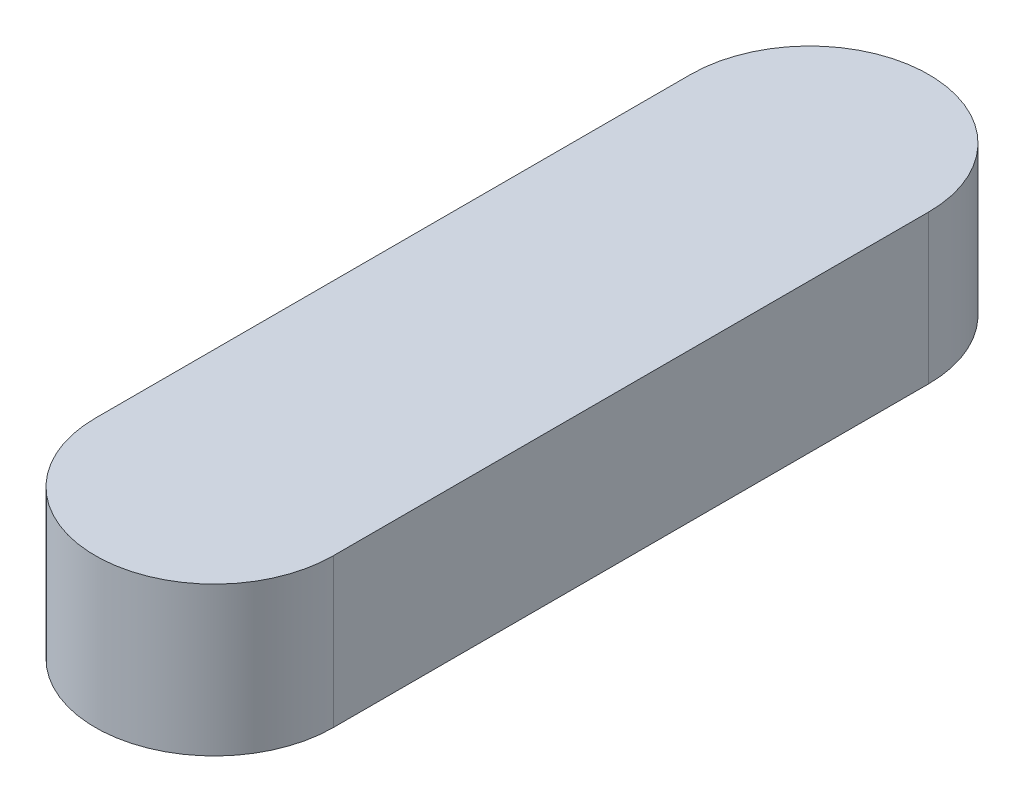
ISO-10303-21;
HEADER;
FILE_DESCRIPTION(('STEP AP214'),'2;1');
FILE_NAME('part.step','',(''),(''),'','','');
FILE_SCHEMA(('AUTOMOTIVE_DESIGN { 1 0 10303 214 1 1 1 1 }'));
ENDSEC;
DATA;
#1=APPLICATION_CONTEXT('core data for automotive mechanical design processes');
#2=APPLICATION_PROTOCOL_DEFINITION('international standard','automotive_design',2000,#1);
#3=PRODUCT_CONTEXT('',#1,'mechanical');
#4=PRODUCT('Part','Part','',(#3));
#5=PRODUCT_RELATED_PRODUCT_CATEGORY('part','',(#4));
#6=PRODUCT_DEFINITION_FORMATION('','',#4);
#7=PRODUCT_DEFINITION_CONTEXT('part definition',#1,'design');
#8=PRODUCT_DEFINITION('design','',#6,#7);
#9=PRODUCT_DEFINITION_SHAPE('','',#8);
#10=(LENGTH_UNIT() NAMED_UNIT(*) SI_UNIT(.MILLI.,.METRE.));
#11=(NAMED_UNIT(*) PLANE_ANGLE_UNIT() SI_UNIT($,.RADIAN.));
#12=(NAMED_UNIT(*) SI_UNIT($,.STERADIAN.) SOLID_ANGLE_UNIT());
#13=UNCERTAINTY_MEASURE_WITH_UNIT(LENGTH_MEASURE(1.E-05),#10,'distance_accuracy_value','');
#14=(GEOMETRIC_REPRESENTATION_CONTEXT(3) GLOBAL_UNCERTAINTY_ASSIGNED_CONTEXT((#13)) GLOBAL_UNIT_ASSIGNED_CONTEXT((#10,
#11,#12)) REPRESENTATION_CONTEXT('',''));
#15=CARTESIAN_POINT('',(0.,0.,0.));
#16=DIRECTION('',(0.,0.,1.));
#17=DIRECTION('',(1.,0.,0.));
#18=AXIS2_PLACEMENT_3D('',#15,#16,#17);
#19=CARTESIAN_POINT('',(0.,-5.,20.));
#20=DIRECTION('',(0.,1.,0.));
#21=DIRECTION('',(0.,0.,1.));
#22=AXIS2_PLACEMENT_3D('',#19,#20,#21);
#23=CYLINDRICAL_SURFACE('',#22,8.);
#24=CARTESIAN_POINT('',(0.,5.,20.));
#25=DIRECTION('',(0.,1.,0.));
#26=DIRECTION('',(0.,0.,1.));
#27=AXIS2_PLACEMENT_3D('',#24,#25,#26);
#28=CIRCLE('',#27,8.);
#29=CARTESIAN_POINT('',(-8.,5.,20.));
#30=VERTEX_POINT('',#29);
#31=CARTESIAN_POINT('',(8.,5.,20.));
#32=VERTEX_POINT('',#31);
#33=EDGE_CURVE('E105',#30,#32,#28,.T.);
#34=ORIENTED_EDGE('',*,*,#33,.F.);
#35=DIRECTION('',(0.,1.,0.));
#36=VECTOR('',#35,1.);
#37=CARTESIAN_POINT('',(-8.,-5.,20.));
#38=LINE('',#37,#36);
#39=CARTESIAN_POINT('',(-8.,-5.,20.));
#40=VERTEX_POINT('',#39);
#41=EDGE_CURVE('E11',#40,#30,#38,.T.);
#42=ORIENTED_EDGE('',*,*,#41,.F.);
#43=CARTESIAN_POINT('',(0.,-5.,20.));
#44=DIRECTION('',(0.,1.,0.));
#45=DIRECTION('',(0.,0.,1.));
#46=AXIS2_PLACEMENT_3D('',#43,#44,#45);
#47=CIRCLE('',#46,8.);
#48=CARTESIAN_POINT('',(8.,-5.,20.));
#49=VERTEX_POINT('',#48);
#50=EDGE_CURVE('E99',#40,#49,#47,.T.);
#51=ORIENTED_EDGE('',*,*,#50,.T.);
#52=DIRECTION('',(0.,1.,0.));
#53=VECTOR('',#52,1.);
#54=CARTESIAN_POINT('',(8.,-5.,20.));
#55=LINE('',#54,#53);
#56=EDGE_CURVE('E44',#49,#32,#55,.T.);
#57=ORIENTED_EDGE('',*,*,#56,.T.);
#58=EDGE_LOOP('',(#34,#42,#51,#57));
#59=FACE_BOUND('',#58,.T.);
#60=ADVANCED_FACE('F41',(#59),#23,.T.);
#61=CARTESIAN_POINT('',(-8.,-5.,20.));
#62=DIRECTION('',(-1.,0.,0.));
#63=DIRECTION('',(0.,0.,1.));
#64=AXIS2_PLACEMENT_3D('',#61,#62,#63);
#65=PLANE('',#64);
#66=DIRECTION('',(0.,0.,1.));
#67=VECTOR('',#66,1.);
#68=CARTESIAN_POINT('',(-8.,5.,20.));
#69=LINE('',#68,#67);
#70=CARTESIAN_POINT('',(-8.,5.,-20.));
#71=VERTEX_POINT('',#70);
#72=EDGE_CURVE('E101',#71,#30,#69,.T.);
#73=ORIENTED_EDGE('',*,*,#72,.F.);
#74=DIRECTION('',(0.,1.,0.));
#75=VECTOR('',#74,1.);
#76=CARTESIAN_POINT('',(-8.,-5.,-20.));
#77=LINE('',#76,#75);
#78=CARTESIAN_POINT('',(-8.,-5.,-20.));
#79=VERTEX_POINT('',#78);
#80=EDGE_CURVE('E50',#79,#71,#77,.T.);
#81=ORIENTED_EDGE('',*,*,#80,.F.);
#82=DIRECTION('',(0.,0.,1.));
#83=VECTOR('',#82,1.);
#84=CARTESIAN_POINT('',(-8.,-5.,20.));
#85=LINE('',#84,#83);
#86=EDGE_CURVE('E96',#79,#40,#85,.T.);
#87=ORIENTED_EDGE('',*,*,#86,.T.);
#88=ORIENTED_EDGE('',*,*,#41,.T.);
#89=EDGE_LOOP('',(#73,#81,#87,#88));
#90=FACE_BOUND('',#89,.T.);
#91=ADVANCED_FACE('F115',(#90),#65,.T.);
#92=CARTESIAN_POINT('',(0.,-5.,-20.));
#93=DIRECTION('',(0.,1.,0.));
#94=DIRECTION('',(0.,0.,1.));
#95=AXIS2_PLACEMENT_3D('',#92,#93,#94);
#96=CYLINDRICAL_SURFACE('',#95,8.);
#97=CARTESIAN_POINT('',(0.,5.,-20.));
#98=DIRECTION('',(0.,1.,0.));
#99=DIRECTION('',(0.,0.,1.));
#100=AXIS2_PLACEMENT_3D('',#97,#98,#99);
#101=CIRCLE('',#100,8.);
#102=CARTESIAN_POINT('',(8.,5.,-20.));
#103=VERTEX_POINT('',#102);
#104=EDGE_CURVE('E91',#103,#71,#101,.T.);
#105=ORIENTED_EDGE('',*,*,#104,.F.);
#106=DIRECTION('',(0.,1.,0.));
#107=VECTOR('',#106,1.);
#108=CARTESIAN_POINT('',(8.,-5.,-20.));
#109=LINE('',#108,#107);
#110=CARTESIAN_POINT('',(8.,-5.,-20.));
#111=VERTEX_POINT('',#110);
#112=EDGE_CURVE('E86',#111,#103,#109,.T.);
#113=ORIENTED_EDGE('',*,*,#112,.F.);
#114=CARTESIAN_POINT('',(0.,-5.,-20.));
#115=DIRECTION('',(0.,1.,0.));
#116=DIRECTION('',(0.,0.,1.));
#117=AXIS2_PLACEMENT_3D('',#114,#115,#116);
#118=CIRCLE('',#117,8.);
#119=EDGE_CURVE('E89',#111,#79,#118,.T.);
#120=ORIENTED_EDGE('',*,*,#119,.T.);
#121=ORIENTED_EDGE('',*,*,#80,.T.);
#122=EDGE_LOOP('',(#105,#113,#120,#121));
#123=FACE_BOUND('',#122,.T.);
#124=ADVANCED_FACE('F88',(#123),#96,.T.);
#125=CARTESIAN_POINT('',(8.,-5.,20.));
#126=DIRECTION('',(1.,0.,0.));
#127=DIRECTION('',(0.,0.,-1.));
#128=AXIS2_PLACEMENT_3D('',#125,#126,#127);
#129=PLANE('',#128);
#130=DIRECTION('',(0.,0.,-1.));
#131=VECTOR('',#130,1.);
#132=CARTESIAN_POINT('',(8.,5.,20.));
#133=LINE('',#132,#131);
#134=EDGE_CURVE('E108',#32,#103,#133,.T.);
#135=ORIENTED_EDGE('',*,*,#134,.F.);
#136=ORIENTED_EDGE('',*,*,#56,.F.);
#137=DIRECTION('',(0.,0.,-1.));
#138=VECTOR('',#137,1.);
#139=CARTESIAN_POINT('',(8.,-5.,20.));
#140=LINE('',#139,#138);
#141=EDGE_CURVE('E95',#49,#111,#140,.T.);
#142=ORIENTED_EDGE('',*,*,#141,.T.);
#143=ORIENTED_EDGE('',*,*,#112,.T.);
#144=EDGE_LOOP('',(#135,#136,#142,#143));
#145=FACE_BOUND('',#144,.T.);
#146=ADVANCED_FACE('F98',(#145),#129,.T.);
#147=CARTESIAN_POINT('',(0.,-5.,20.));
#148=DIRECTION('',(0.,1.,0.));
#149=DIRECTION('',(0.,0.,1.));
#150=AXIS2_PLACEMENT_3D('',#147,#148,#149);
#151=PLANE('',#150);
#152=ORIENTED_EDGE('',*,*,#50,.F.);
#153=ORIENTED_EDGE('',*,*,#86,.F.);
#154=ORIENTED_EDGE('',*,*,#119,.F.);
#155=ORIENTED_EDGE('',*,*,#141,.F.);
#156=EDGE_LOOP('',(#152,#153,#154,#155));
#157=FACE_BOUND('',#156,.T.);
#158=ADVANCED_FACE('F94',(#157),#151,.F.);
#159=CARTESIAN_POINT('',(0.,5.,20.));
#160=DIRECTION('',(0.,1.,0.));
#161=DIRECTION('',(0.,0.,1.));
#162=AXIS2_PLACEMENT_3D('',#159,#160,#161);
#163=PLANE('',#162);
#164=ORIENTED_EDGE('',*,*,#33,.T.);
#165=ORIENTED_EDGE('',*,*,#134,.T.);
#166=ORIENTED_EDGE('',*,*,#104,.T.);
#167=ORIENTED_EDGE('',*,*,#72,.T.);
#168=EDGE_LOOP('',(#164,#165,#166,#167));
#169=FACE_BOUND('',#168,.T.);
#170=ADVANCED_FACE('F114',(#169),#163,.T.);
#171=CLOSED_SHELL('',(#60,#91,#124,#146,#158,#170));
#172=MANIFOLD_SOLID_BREP('B2',#171);
#173=ADVANCED_BREP_SHAPE_REPRESENTATION('',(#18,#172),#14);
#174=SHAPE_DEFINITION_REPRESENTATION(#9,#173);
ENDSEC;
END-ISO-10303-21;
